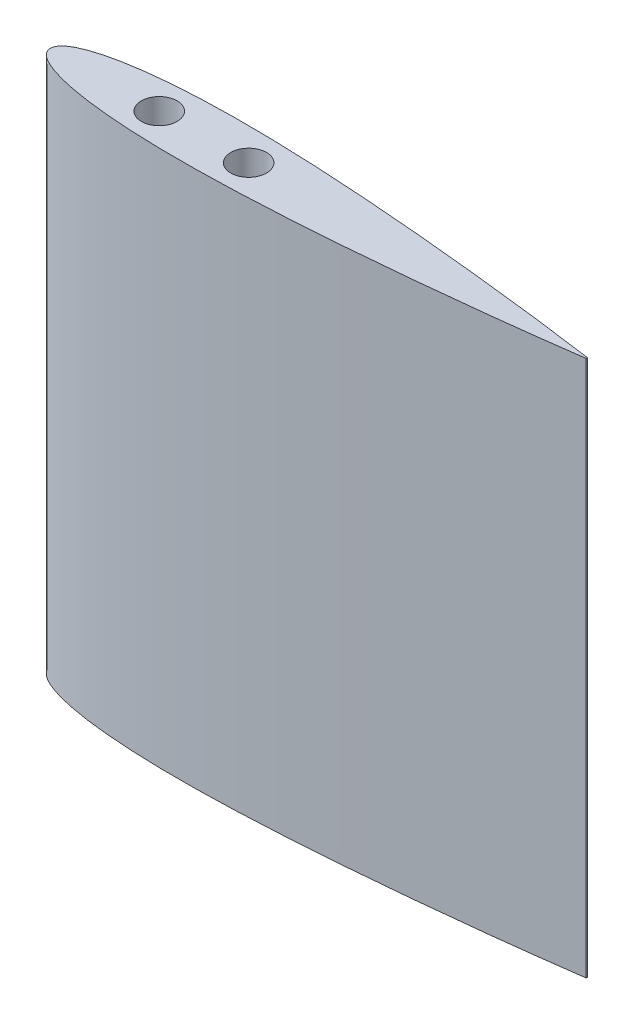
ISO-10303-21;
HEADER;
FILE_DESCRIPTION(('STEP AP214'),'2;1');
FILE_NAME('part.step','',(''),(''),'','','');
FILE_SCHEMA(('AUTOMOTIVE_DESIGN { 1 0 10303 214 1 1 1 1 }'));
ENDSEC;
DATA;
#1=APPLICATION_CONTEXT('core data for automotive mechanical design processes');
#2=APPLICATION_PROTOCOL_DEFINITION('international standard','automotive_design',2000,#1);
#3=PRODUCT_CONTEXT('',#1,'mechanical');
#4=PRODUCT('Part','Part','',(#3));
#5=PRODUCT_RELATED_PRODUCT_CATEGORY('part','',(#4));
#6=PRODUCT_DEFINITION_FORMATION('','',#4);
#7=PRODUCT_DEFINITION_CONTEXT('part definition',#1,'design');
#8=PRODUCT_DEFINITION('design','',#6,#7);
#9=PRODUCT_DEFINITION_SHAPE('','',#8);
#10=(LENGTH_UNIT() NAMED_UNIT(*) SI_UNIT(.MILLI.,.METRE.));
#11=(NAMED_UNIT(*) PLANE_ANGLE_UNIT() SI_UNIT($,.RADIAN.));
#12=(NAMED_UNIT(*) SI_UNIT($,.STERADIAN.) SOLID_ANGLE_UNIT());
#13=UNCERTAINTY_MEASURE_WITH_UNIT(LENGTH_MEASURE(1.E-05),#10,'distance_accuracy_value','');
#14=(GEOMETRIC_REPRESENTATION_CONTEXT(3) GLOBAL_UNCERTAINTY_ASSIGNED_CONTEXT((#13)) GLOBAL_UNIT_ASSIGNED_CONTEXT((#10,
#11,#12)) REPRESENTATION_CONTEXT('',''));
#15=CARTESIAN_POINT('',(0.,0.,0.));
#16=DIRECTION('',(0.,0.,1.));
#17=DIRECTION('',(1.,0.,0.));
#18=AXIS2_PLACEMENT_3D('',#15,#16,#17);
#19=CARTESIAN_POINT('',(76.1989566502506,38.1,-0.0480060000004375));
#20=CARTESIAN_POINT('',(76.1915399014401,38.1,-0.0490477650060024));
#21=CARTESIAN_POINT('',(76.1618995618662,38.1,-0.0532110809426779));
#22=CARTESIAN_POINT('',(76.0436039036933,38.1,-0.0697558566797521));
#23=CARTESIAN_POINT('',(75.8665187753457,38.1,-0.0944867430918495));
#24=CARTESIAN_POINT('',(75.6310091709669,38.1,-0.126965391859817));
#25=CARTESIAN_POINT('',(75.3893532075569,38.1,-0.160190200640066));
#26=CARTESIAN_POINT('',(75.1050837660693,38.1,-0.198904989147177));
#27=CARTESIAN_POINT('',(74.7788745873881,38.1,-0.242859005883783));
#28=CARTESIAN_POINT('',(74.4114981954842,38.1,-0.29186429375764));
#29=CARTESIAN_POINT('',(74.0038084664137,38.1,-0.345569022589199));
#30=CARTESIAN_POINT('',(73.5567553297739,38.1,-0.403720925510189));
#31=CARTESIAN_POINT('',(73.0713736341047,38.1,-0.465853222349795));
#32=CARTESIAN_POINT('',(72.3510167519771,38.1,-0.556772440334828));
#33=CARTESIAN_POINT('',(71.583498245841,38.1,-0.651127112361768));
#34=CARTESIAN_POINT('',(70.770593968194,38.1,-0.748448048269034));
#35=CARTESIAN_POINT('',(70.1123104223475,38.1,-0.825737809246248));
#36=CARTESIAN_POINT('',(69.423727943532,38.1,-0.904853152717327));
#37=CARTESIAN_POINT('',(68.7064939321736,38.1,-0.985592030764006));
#38=CARTESIAN_POINT('',(67.9622610026192,38.1,-1.06737526082977));
#39=CARTESIAN_POINT('',(67.192790938636,38.1,-1.14998319028369));
#40=CARTESIAN_POINT('',(66.3998507297358,38.1,-1.23282548784193));
#41=CARTESIAN_POINT('',(65.5853094971878,38.1,-1.31574863637624));
#42=CARTESIAN_POINT('',(64.7510596252633,38.1,-1.39811320683203));
#43=CARTESIAN_POINT('',(63.8990626700967,38.1,-1.47966051292517));
#44=CARTESIAN_POINT('',(63.0312971234962,38.1,-1.55982417312114));
#45=CARTESIAN_POINT('',(62.1497872694255,38.1,-1.63834210110599));
#46=CARTESIAN_POINT('',(61.2565973065241,38.1,-1.71456520147231));
#47=CARTESIAN_POINT('',(60.3538087224743,38.1,-1.78815253623483));
#48=CARTESIAN_POINT('',(59.4435414358386,38.1,-1.8586341649136));
#49=CARTESIAN_POINT('',(58.5279098013775,38.1,-1.92544429568854));
#50=CARTESIAN_POINT('',(57.6090655922432,38.1,-1.98816390230962));
#51=CARTESIAN_POINT('',(56.6891537188279,38.1,-2.04629199099476));
#52=CARTESIAN_POINT('',(55.7703034883076,38.1,-2.09926717966157));
#53=CARTESIAN_POINT('',(54.5536892335224,38.1,-2.16225319255793));
#54=CARTESIAN_POINT('',(53.0515324187531,38.1,-2.22569702265728));
#55=CARTESIAN_POINT('',(51.5649281979661,38.1,-2.26664545387194));
#56=CARTESIAN_POINT('',(50.3990477819981,38.1,-2.28358455102085));
#57=CARTESIAN_POINT('',(49.5469916789001,38.1,-2.28804827308297));
#58=CARTESIAN_POINT('',(48.7126833054312,38.1,-2.28410223520037));
#59=CARTESIAN_POINT('',(47.8980752567122,38.1,-2.27156902201942));
#60=CARTESIAN_POINT('',(47.1050764204523,38.1,-2.25006986753491));
#61=CARTESIAN_POINT('',(46.3355212029017,38.1,-2.21969990978299));
#62=CARTESIAN_POINT('',(45.5912052603655,38.1,-2.18024093358921));
#63=CARTESIAN_POINT('',(44.873861454892,38.1,-2.13180353660569));
#64=CARTESIAN_POINT('',(44.1851789691338,38.1,-2.07439781875675));
#65=CARTESIAN_POINT('',(43.5267589482719,38.1,-2.00812811550931));
#66=CARTESIAN_POINT('',(42.9001312529817,38.1,-1.93324581886238));
#67=CARTESIAN_POINT('',(42.3067405051686,38.1,-1.85005530448893));
#68=CARTESIAN_POINT('',(41.7479845921671,38.1,-1.75871164667076));
#69=CARTESIAN_POINT('',(41.2251440770093,38.1,-1.65967136646697));
#70=CARTESIAN_POINT('',(40.7394222685257,38.1,-1.55330686977673));
#71=CARTESIAN_POINT('',(40.2919543382146,38.1,-1.43997872175097));
#72=CARTESIAN_POINT('',(39.8837290506632,38.1,-1.32019461373093));
#73=CARTESIAN_POINT('',(39.5156465419665,38.1,-1.19435234825147));
#74=CARTESIAN_POINT('',(39.1884917681487,38.1,-1.06288655664475));
#75=CARTESIAN_POINT('',(38.9029123471029,38.1,-0.926176493001515));
#76=CARTESIAN_POINT('',(38.6594523447893,38.1,-0.784506781043503));
#77=CARTESIAN_POINT('',(38.4583952602907,38.1,-0.638117578672521));
#78=CARTESIAN_POINT('',(38.3001295903998,38.1,-0.486768083972407));
#79=CARTESIAN_POINT('',(38.1850369971821,38.1,-0.330029548931137));
#80=CARTESIAN_POINT('',(38.1146692041191,38.1,-0.167135854074388));
#81=CARTESIAN_POINT('',(38.0912976935738,38.1,0.));
#82=CARTESIAN_POINT('',(38.1146692041191,38.1,0.167135854074272));
#83=CARTESIAN_POINT('',(38.1850369971821,38.1,0.330029548931012));
#84=CARTESIAN_POINT('',(38.3001295903998,38.1,0.486768083972286));
#85=CARTESIAN_POINT('',(38.4583952602907,38.1,0.638117578672393));
#86=CARTESIAN_POINT('',(38.6594523447893,38.1,0.784506781043372));
#87=CARTESIAN_POINT('',(38.9029123471029,38.1,0.926176493001381));
#88=CARTESIAN_POINT('',(39.1884917681487,38.1,1.06288655664461));
#89=CARTESIAN_POINT('',(39.5156465419666,38.1,1.19435234825133));
#90=CARTESIAN_POINT('',(39.8837290506632,38.1,1.32019461373078));
#91=CARTESIAN_POINT('',(40.2919543382146,38.1,1.4399787217508));
#92=CARTESIAN_POINT('',(40.7394222685258,38.1,1.55330686977656));
#93=CARTESIAN_POINT('',(41.2251440770094,38.1,1.65967136646679));
#94=CARTESIAN_POINT('',(41.7479845921671,38.1,1.75871164667057));
#95=CARTESIAN_POINT('',(42.3067405051687,38.1,1.85005530448873));
#96=CARTESIAN_POINT('',(42.9001312529818,38.1,1.93324581886216));
#97=CARTESIAN_POINT('',(43.526758948272,38.1,2.00812811550908));
#98=CARTESIAN_POINT('',(44.1851789691338,38.1,2.07439781875651));
#99=CARTESIAN_POINT('',(44.873861454892,38.1,2.13180353660544));
#100=CARTESIAN_POINT('',(45.5912052603655,38.1,2.18024093358894));
#101=CARTESIAN_POINT('',(46.3355212029018,38.1,2.2196999097827));
#102=CARTESIAN_POINT('',(47.1050764204523,38.1,2.25006986753461));
#103=CARTESIAN_POINT('',(47.8980752567123,38.1,2.27156902201911));
#104=CARTESIAN_POINT('',(48.7126833054313,38.1,2.28410223520004));
#105=CARTESIAN_POINT('',(49.5469916789001,38.1,2.28804827308262));
#106=CARTESIAN_POINT('',(50.3990477819981,38.1,2.28358455102048));
#107=CARTESIAN_POINT('',(51.5649281979662,38.1,2.26664545387155));
#108=CARTESIAN_POINT('',(52.7476688064124,38.1,2.23406692908831));
#109=CARTESIAN_POINT('',(54.2500260840639,38.1,2.1762155967344));
#110=CARTESIAN_POINT('',(55.4668374509797,38.1,2.11676314369032));
#111=CARTESIAN_POINT('',(56.6891537188279,38.1,2.04629199099427));
#112=CARTESIAN_POINT('',(57.6090655922433,38.1,1.98816390230912));
#113=CARTESIAN_POINT('',(58.5279098013776,38.1,1.92544429568802));
#114=CARTESIAN_POINT('',(59.4435414358386,38.1,1.85863416491306));
#115=CARTESIAN_POINT('',(60.3538087224743,38.1,1.78815253623426));
#116=CARTESIAN_POINT('',(61.2565973065241,38.1,1.71456520147173));
#117=CARTESIAN_POINT('',(62.1497872694255,38.1,1.63834210110539));
#118=CARTESIAN_POINT('',(63.0312971234962,38.1,1.55982417312052));
#119=CARTESIAN_POINT('',(63.8990626700967,38.1,1.47966051292454));
#120=CARTESIAN_POINT('',(64.7510596252633,38.1,1.39811320683138));
#121=CARTESIAN_POINT('',(65.5853094971878,38.1,1.31574863637558));
#122=CARTESIAN_POINT('',(66.3998507297358,38.1,1.23282548784125));
#123=CARTESIAN_POINT('',(67.1927909386361,38.1,1.14998319028299));
#124=CARTESIAN_POINT('',(67.9622610026192,38.1,1.06737526082906));
#125=CARTESIAN_POINT('',(68.7064939321736,38.1,0.985592030763277));
#126=CARTESIAN_POINT('',(69.423727943532,38.1,0.904853152716587));
#127=CARTESIAN_POINT('',(70.1123104223476,38.1,0.825737809245494));
#128=CARTESIAN_POINT('',(70.770593968194,38.1,0.748448048268266));
#129=CARTESIAN_POINT('',(71.583498245841,38.1,0.651127112360985));
#130=CARTESIAN_POINT('',(72.3510167519771,38.1,0.55677244033403));
#131=CARTESIAN_POINT('',(73.0713736341047,38.1,0.465853222348983));
#132=CARTESIAN_POINT('',(73.5567553297739,38.1,0.403720925509366));
#133=CARTESIAN_POINT('',(74.0038084664137,38.1,0.345569022588368));
#134=CARTESIAN_POINT('',(74.4114981954842,38.1,0.2918642937568));
#135=CARTESIAN_POINT('',(74.7788745873881,38.1,0.242859005882935));
#136=CARTESIAN_POINT('',(75.1050837660693,38.1,0.198904989146324));
#137=CARTESIAN_POINT('',(75.389353207557,38.1,0.160190200639207));
#138=CARTESIAN_POINT('',(75.6310091709668,38.1,0.126965391858953));
#139=CARTESIAN_POINT('',(75.8665187753457,38.1,0.0944867430909816));
#140=CARTESIAN_POINT('',(76.0436039036934,38.1,0.0697558566788804));
#141=CARTESIAN_POINT('',(76.1618995618662,38.1,0.053211080941803));
#142=CARTESIAN_POINT('',(76.1915399014401,38.1,0.0490477650051275));
#143=CARTESIAN_POINT('',(76.1989566502506,38.1,0.0480059999995625));
#144=B_SPLINE_CURVE_WITH_KNOTS('',3,(#19,#20,#21,#22,#23,#24,#25,#26,#27,#28,#29,#30,#31,#32,
#33,#34,#35,#36,#37,#38,#39,#40,#41,#42,#43,#44,#45,#46,#47,#48,#49,#50,#51,#52,#53,#54,#55,#56,
#57,#58,#59,#60,#61,#62,#63,#64,#65,#66,#67,#68,#69,#70,#71,#72,#73,#74,#75,#76,#77,#78,#79,#80,
#81,#82,#83,#84,#85,#86,#87,#88,#89,#90,#91,#92,#93,#94,#95,#96,#97,#98,#99,#100,#101,#102,#103,
#104,#105,#106,#107,#108,#109,#110,#111,#112,#113,#114,#115,#116,#117,#118,#119,#120,#121,#122,
#123,#124,#125,#126,#127,#128,#129,#130,#131,#132,#133,#134,#135,#136,#137,#138,#139,#140,#141,
#142,#143),.UNSPECIFIED.,.F.,.F.,(4,1,1,1,1,1,1,1,1,1,1,1,1,1,1,1,1,1,1,1,1,1,1,1,1,1,1,1,1,1,1,
1,1,1,1,1,1,1,1,1,1,1,1,1,1,1,1,1,1,1,1,1,1,1,1,1,1,1,1,1,1,1,1,1,1,1,1,1,1,1,1,1,1,1,1,1,1,1,1,
1,1,1,1,1,1,1,1,1,1,1,1,1,1,1,1,1,1,1,1,1,1,1,1,1,1,1,1,1,1,1,1,1,1,1,1,1,1,1,1,1,1,1,4),(0.,
0.000289201378228521,0.00115576612811497,0.00461232240327458,0.00719351750498132,
0.0103357928948399,0.0140313969623455,0.018271612085312,0.0230458473649678,0.028342900869087,
0.0341501195438392,0.0404537601194176,0.0472383298988337,0.0621866127014249,0.0703137241968128,
0.0788519079930909,0.0877801263970521,0.0970775209084767,0.106722048517726,0.116690867689892,
0.126960504753417,0.137507218023907,0.148306054540842,0.159330764906486,0.170556489755232,
0.181956531155254,0.193504043461122,0.205171366742428,0.216932300344852,0.228758168756787,
0.24062140048393,0.252494935762872,0.264350287074715,0.276160573352716,0.299535853600575,
0.322404758964057,0.333584031906799,0.344559265520828,0.35530595971865,0.365799778375851,
0.376017570419826,0.385937299648592,0.395537658905913,0.404797976198219,0.413698812078543,
0.422221441287427,0.430349273099822,0.438066019294824,0.445356904422305,0.452209372098903,
0.458611567079498,0.46455404405062,0.470029850192536,0.475034902370301,0.479569141493346,
0.483636857140142,0.487250262770082,0.490431337960153,0.493218828079602,0.495674085869199,
0.497891368316545,0.5,0.502108631683455,0.504325914130801,0.506781171920398,0.509568662039847,
0.512749737229917,0.516363142859858,0.520430858506653,0.524965097629699,0.529970149807463,
0.535445955949379,0.541388432920502,0.547790627901097,0.554643095577695,0.561933980705176,
0.569650726900177,0.577778558712573,0.586301187921457,0.595202023801781,0.604462341094087,
0.614062700351407,0.623982429580174,0.634200221624149,0.64469404028135,0.655440734479172,
0.666415968093201,0.677595241035942,0.700464146399425,0.712102005681195,0.735649712925285,
0.747505064237128,0.759378599516069,0.771241831243212,0.783067699655148,0.794828633257571,
0.806495956538878,0.818043468844746,0.829443510244767,0.840669235093514,0.851693945459158,
0.862492781976093,0.873039495246583,0.883309132310108,0.893277951482274,0.902922479091523,
0.912219873602948,0.921148092006909,0.929686275803187,0.937813387298575,0.952761670101166,
0.959546239880582,0.965849880456161,0.971657099130913,0.976954152635032,0.981728387914688,
0.985968603037654,0.98966420710516,0.992806482495019,0.995387677596725,0.998844233871885,
0.999710798621771,1.),.UNSPECIFIED.);
#145=DIRECTION('',(0.,-1.,0.));
#146=VECTOR('',#145,1.);
#147=SURFACE_OF_LINEAR_EXTRUSION('',#144,#146);
#148=CARTESIAN_POINT('',(76.1989566502506,0.,-0.0480060000004375));
#149=CARTESIAN_POINT('',(76.1915399014401,0.,-0.0490477650060024));
#150=CARTESIAN_POINT('',(76.1618995618662,0.,-0.0532110809426779));
#151=CARTESIAN_POINT('',(76.0436039036933,0.,-0.0697558566797521));
#152=CARTESIAN_POINT('',(75.8665187753457,0.,-0.0944867430918495));
#153=CARTESIAN_POINT('',(75.6310091709669,0.,-0.126965391859817));
#154=CARTESIAN_POINT('',(75.3893532075569,0.,-0.160190200640066));
#155=CARTESIAN_POINT('',(75.1050837660693,0.,-0.198904989147177));
#156=CARTESIAN_POINT('',(74.7788745873881,0.,-0.242859005883783));
#157=CARTESIAN_POINT('',(74.4114981954842,0.,-0.29186429375764));
#158=CARTESIAN_POINT('',(74.0038084664137,0.,-0.345569022589199));
#159=CARTESIAN_POINT('',(73.5567553297739,0.,-0.403720925510189));
#160=CARTESIAN_POINT('',(73.0713736341047,0.,-0.465853222349795));
#161=CARTESIAN_POINT('',(72.3510167519771,0.,-0.556772440334828));
#162=CARTESIAN_POINT('',(71.583498245841,0.,-0.651127112361768));
#163=CARTESIAN_POINT('',(70.770593968194,0.,-0.748448048269034));
#164=CARTESIAN_POINT('',(70.1123104223475,0.,-0.825737809246248));
#165=CARTESIAN_POINT('',(69.423727943532,0.,-0.904853152717327));
#166=CARTESIAN_POINT('',(68.7064939321736,0.,-0.985592030764006));
#167=CARTESIAN_POINT('',(67.9622610026192,0.,-1.06737526082977));
#168=CARTESIAN_POINT('',(67.192790938636,0.,-1.14998319028369));
#169=CARTESIAN_POINT('',(66.3998507297358,0.,-1.23282548784193));
#170=CARTESIAN_POINT('',(65.5853094971878,0.,-1.31574863637624));
#171=CARTESIAN_POINT('',(64.7510596252633,0.,-1.39811320683203));
#172=CARTESIAN_POINT('',(63.8990626700967,0.,-1.47966051292517));
#173=CARTESIAN_POINT('',(63.0312971234962,0.,-1.55982417312114));
#174=CARTESIAN_POINT('',(62.1497872694255,0.,-1.63834210110599));
#175=CARTESIAN_POINT('',(61.2565973065241,0.,-1.71456520147231));
#176=CARTESIAN_POINT('',(60.3538087224743,0.,-1.78815253623483));
#177=CARTESIAN_POINT('',(59.4435414358386,0.,-1.8586341649136));
#178=CARTESIAN_POINT('',(58.5279098013775,0.,-1.92544429568854));
#179=CARTESIAN_POINT('',(57.6090655922432,0.,-1.98816390230962));
#180=CARTESIAN_POINT('',(56.6891537188279,0.,-2.04629199099476));
#181=CARTESIAN_POINT('',(55.7703034883076,0.,-2.09926717966157));
#182=CARTESIAN_POINT('',(54.5536892335224,0.,-2.16225319255793));
#183=CARTESIAN_POINT('',(53.0515324187531,0.,-2.22569702265728));
#184=CARTESIAN_POINT('',(51.5649281979661,0.,-2.26664545387194));
#185=CARTESIAN_POINT('',(50.3990477819981,0.,-2.28358455102085));
#186=CARTESIAN_POINT('',(49.5469916789001,0.,-2.28804827308297));
#187=CARTESIAN_POINT('',(48.7126833054312,0.,-2.28410223520037));
#188=CARTESIAN_POINT('',(47.8980752567122,0.,-2.27156902201942));
#189=CARTESIAN_POINT('',(47.1050764204523,0.,-2.25006986753491));
#190=CARTESIAN_POINT('',(46.3355212029017,0.,-2.21969990978299));
#191=CARTESIAN_POINT('',(45.5912052603655,0.,-2.18024093358921));
#192=CARTESIAN_POINT('',(44.873861454892,0.,-2.13180353660569));
#193=CARTESIAN_POINT('',(44.1851789691338,0.,-2.07439781875675));
#194=CARTESIAN_POINT('',(43.5267589482719,0.,-2.00812811550931));
#195=CARTESIAN_POINT('',(42.9001312529817,0.,-1.93324581886238));
#196=CARTESIAN_POINT('',(42.3067405051686,0.,-1.85005530448893));
#197=CARTESIAN_POINT('',(41.7479845921671,0.,-1.75871164667076));
#198=CARTESIAN_POINT('',(41.2251440770093,0.,-1.65967136646697));
#199=CARTESIAN_POINT('',(40.7394222685257,0.,-1.55330686977673));
#200=CARTESIAN_POINT('',(40.2919543382146,0.,-1.43997872175097));
#201=CARTESIAN_POINT('',(39.8837290506632,0.,-1.32019461373093));
#202=CARTESIAN_POINT('',(39.5156465419665,0.,-1.19435234825147));
#203=CARTESIAN_POINT('',(39.1884917681487,0.,-1.06288655664475));
#204=CARTESIAN_POINT('',(38.9029123471029,0.,-0.926176493001515));
#205=CARTESIAN_POINT('',(38.6594523447893,0.,-0.784506781043503));
#206=CARTESIAN_POINT('',(38.4583952602907,0.,-0.638117578672521));
#207=CARTESIAN_POINT('',(38.3001295903998,0.,-0.486768083972407));
#208=CARTESIAN_POINT('',(38.1850369971821,0.,-0.330029548931137));
#209=CARTESIAN_POINT('',(38.1146692041191,0.,-0.167135854074388));
#210=CARTESIAN_POINT('',(38.0912976935738,0.,0.));
#211=CARTESIAN_POINT('',(38.1146692041191,0.,0.167135854074272));
#212=CARTESIAN_POINT('',(38.1850369971821,0.,0.330029548931012));
#213=CARTESIAN_POINT('',(38.3001295903998,0.,0.486768083972286));
#214=CARTESIAN_POINT('',(38.4583952602907,0.,0.638117578672393));
#215=CARTESIAN_POINT('',(38.6594523447893,0.,0.784506781043372));
#216=CARTESIAN_POINT('',(38.9029123471029,0.,0.926176493001381));
#217=CARTESIAN_POINT('',(39.1884917681487,0.,1.06288655664461));
#218=CARTESIAN_POINT('',(39.5156465419666,0.,1.19435234825133));
#219=CARTESIAN_POINT('',(39.8837290506632,0.,1.32019461373078));
#220=CARTESIAN_POINT('',(40.2919543382146,0.,1.4399787217508));
#221=CARTESIAN_POINT('',(40.7394222685258,0.,1.55330686977656));
#222=CARTESIAN_POINT('',(41.2251440770094,0.,1.65967136646679));
#223=CARTESIAN_POINT('',(41.7479845921671,0.,1.75871164667057));
#224=CARTESIAN_POINT('',(42.3067405051687,0.,1.85005530448873));
#225=CARTESIAN_POINT('',(42.9001312529818,0.,1.93324581886216));
#226=CARTESIAN_POINT('',(43.526758948272,0.,2.00812811550908));
#227=CARTESIAN_POINT('',(44.1851789691338,0.,2.07439781875651));
#228=CARTESIAN_POINT('',(44.873861454892,0.,2.13180353660544));
#229=CARTESIAN_POINT('',(45.5912052603655,0.,2.18024093358894));
#230=CARTESIAN_POINT('',(46.3355212029018,0.,2.2196999097827));
#231=CARTESIAN_POINT('',(47.1050764204523,0.,2.25006986753461));
#232=CARTESIAN_POINT('',(47.8980752567123,0.,2.27156902201911));
#233=CARTESIAN_POINT('',(48.7126833054313,0.,2.28410223520004));
#234=CARTESIAN_POINT('',(49.5469916789001,0.,2.28804827308262));
#235=CARTESIAN_POINT('',(50.3990477819981,0.,2.28358455102048));
#236=CARTESIAN_POINT('',(51.5649281979662,0.,2.26664545387155));
#237=CARTESIAN_POINT('',(52.7476688064124,0.,2.23406692908831));
#238=CARTESIAN_POINT('',(54.2500260840639,0.,2.1762155967344));
#239=CARTESIAN_POINT('',(55.4668374509797,0.,2.11676314369032));
#240=CARTESIAN_POINT('',(56.6891537188279,0.,2.04629199099427));
#241=CARTESIAN_POINT('',(57.6090655922433,0.,1.98816390230912));
#242=CARTESIAN_POINT('',(58.5279098013776,0.,1.92544429568802));
#243=CARTESIAN_POINT('',(59.4435414358386,0.,1.85863416491306));
#244=CARTESIAN_POINT('',(60.3538087224743,0.,1.78815253623426));
#245=CARTESIAN_POINT('',(61.2565973065241,0.,1.71456520147173));
#246=CARTESIAN_POINT('',(62.1497872694255,0.,1.63834210110539));
#247=CARTESIAN_POINT('',(63.0312971234962,0.,1.55982417312052));
#248=CARTESIAN_POINT('',(63.8990626700967,0.,1.47966051292454));
#249=CARTESIAN_POINT('',(64.7510596252633,0.,1.39811320683138));
#250=CARTESIAN_POINT('',(65.5853094971878,0.,1.31574863637558));
#251=CARTESIAN_POINT('',(66.3998507297358,0.,1.23282548784125));
#252=CARTESIAN_POINT('',(67.1927909386361,0.,1.14998319028299));
#253=CARTESIAN_POINT('',(67.9622610026192,0.,1.06737526082906));
#254=CARTESIAN_POINT('',(68.7064939321736,0.,0.985592030763277));
#255=CARTESIAN_POINT('',(69.423727943532,0.,0.904853152716587));
#256=CARTESIAN_POINT('',(70.1123104223476,0.,0.825737809245494));
#257=CARTESIAN_POINT('',(70.770593968194,0.,0.748448048268266));
#258=CARTESIAN_POINT('',(71.583498245841,0.,0.651127112360985));
#259=CARTESIAN_POINT('',(72.3510167519771,0.,0.55677244033403));
#260=CARTESIAN_POINT('',(73.0713736341047,0.,0.465853222348983));
#261=CARTESIAN_POINT('',(73.5567553297739,0.,0.403720925509366));
#262=CARTESIAN_POINT('',(74.0038084664137,0.,0.345569022588368));
#263=CARTESIAN_POINT('',(74.4114981954842,0.,0.2918642937568));
#264=CARTESIAN_POINT('',(74.7788745873881,0.,0.242859005882935));
#265=CARTESIAN_POINT('',(75.1050837660693,0.,0.198904989146324));
#266=CARTESIAN_POINT('',(75.389353207557,0.,0.160190200639207));
#267=CARTESIAN_POINT('',(75.6310091709668,0.,0.126965391858953));
#268=CARTESIAN_POINT('',(75.8665187753457,0.,0.0944867430909816));
#269=CARTESIAN_POINT('',(76.0436039036934,0.,0.0697558566788804));
#270=CARTESIAN_POINT('',(76.1618995618662,0.,0.053211080941803));
#271=CARTESIAN_POINT('',(76.1915399014401,0.,0.0490477650051275));
#272=CARTESIAN_POINT('',(76.1989566502506,0.,0.0480059999995625));
#273=B_SPLINE_CURVE_WITH_KNOTS('',3,(#148,#149,#150,#151,#152,#153,#154,#155,#156,#157,#158,
#159,#160,#161,#162,#163,#164,#165,#166,#167,#168,#169,#170,#171,#172,#173,#174,#175,#176,#177,
#178,#179,#180,#181,#182,#183,#184,#185,#186,#187,#188,#189,#190,#191,#192,#193,#194,#195,#196,
#197,#198,#199,#200,#201,#202,#203,#204,#205,#206,#207,#208,#209,#210,#211,#212,#213,#214,#215,
#216,#217,#218,#219,#220,#221,#222,#223,#224,#225,#226,#227,#228,#229,#230,#231,#232,#233,#234,
#235,#236,#237,#238,#239,#240,#241,#242,#243,#244,#245,#246,#247,#248,#249,#250,#251,#252,#253,
#254,#255,#256,#257,#258,#259,#260,#261,#262,#263,#264,#265,#266,#267,#268,#269,#270,#271,#272),
.UNSPECIFIED.,.F.,.F.,(4,1,1,1,1,1,1,1,1,1,1,1,1,1,1,1,1,1,1,1,1,1,1,1,1,1,1,1,1,1,1,1,1,1,1,1,
1,1,1,1,1,1,1,1,1,1,1,1,1,1,1,1,1,1,1,1,1,1,1,1,1,1,1,1,1,1,1,1,1,1,1,1,1,1,1,1,1,1,1,1,1,1,1,1,
1,1,1,1,1,1,1,1,1,1,1,1,1,1,1,1,1,1,1,1,1,1,1,1,1,1,1,1,1,1,1,1,1,1,1,1,1,1,4),(0.,
0.000289201378228521,0.00115576612811497,0.00461232240327458,0.00719351750498132,
0.0103357928948399,0.0140313969623455,0.018271612085312,0.0230458473649678,0.028342900869087,
0.0341501195438392,0.0404537601194176,0.0472383298988337,0.0621866127014249,0.0703137241968128,
0.0788519079930909,0.0877801263970521,0.0970775209084767,0.106722048517726,0.116690867689892,
0.126960504753417,0.137507218023907,0.148306054540842,0.159330764906486,0.170556489755232,
0.181956531155254,0.193504043461122,0.205171366742428,0.216932300344852,0.228758168756787,
0.24062140048393,0.252494935762872,0.264350287074715,0.276160573352716,0.299535853600575,
0.322404758964057,0.333584031906799,0.344559265520828,0.35530595971865,0.365799778375851,
0.376017570419826,0.385937299648592,0.395537658905913,0.404797976198219,0.413698812078543,
0.422221441287427,0.430349273099822,0.438066019294824,0.445356904422305,0.452209372098903,
0.458611567079498,0.46455404405062,0.470029850192536,0.475034902370301,0.479569141493346,
0.483636857140142,0.487250262770082,0.490431337960153,0.493218828079602,0.495674085869199,
0.497891368316545,0.5,0.502108631683455,0.504325914130801,0.506781171920398,0.509568662039847,
0.512749737229917,0.516363142859858,0.520430858506653,0.524965097629699,0.529970149807463,
0.535445955949379,0.541388432920502,0.547790627901097,0.554643095577695,0.561933980705176,
0.569650726900177,0.577778558712573,0.586301187921457,0.595202023801781,0.604462341094087,
0.614062700351407,0.623982429580174,0.634200221624149,0.64469404028135,0.655440734479172,
0.666415968093201,0.677595241035942,0.700464146399425,0.712102005681195,0.735649712925285,
0.747505064237128,0.759378599516069,0.771241831243212,0.783067699655148,0.794828633257571,
0.806495956538878,0.818043468844746,0.829443510244767,0.840669235093514,0.851693945459158,
0.862492781976093,0.873039495246583,0.883309132310108,0.893277951482274,0.902922479091523,
0.912219873602948,0.921148092006909,0.929686275803187,0.937813387298575,0.952761670101166,
0.959546239880582,0.965849880456161,0.971657099130913,0.976954152635032,0.981728387914688,
0.985968603037654,0.98966420710516,0.992806482495019,0.995387677596725,0.998844233871885,
0.999710798621771,1.),.UNSPECIFIED.);
#274=CARTESIAN_POINT('',(76.1989566502506,0.,-0.0480060000004375));
#275=VERTEX_POINT('',#274);
#276=CARTESIAN_POINT('',(76.1989566502506,0.,0.0480059999995625));
#277=VERTEX_POINT('',#276);
#278=EDGE_CURVE('E72',#275,#277,#273,.T.);
#279=ORIENTED_EDGE('',*,*,#278,.T.);
#280=DIRECTION('',(0.,-1.,0.));
#281=VECTOR('',#280,1.);
#282=CARTESIAN_POINT('',(76.1989566502506,38.1,0.0480059999995625));
#283=LINE('',#282,#281);
#284=CARTESIAN_POINT('',(76.1989566502506,38.1,0.0480059999995625));
#285=VERTEX_POINT('',#284);
#286=EDGE_CURVE('E11',#285,#277,#283,.T.);
#287=ORIENTED_EDGE('',*,*,#286,.F.);
#288=CARTESIAN_POINT('',(76.1989566502506,38.1,-0.0480060000004375));
#289=VERTEX_POINT('',#288);
#290=EDGE_CURVE('E71',#289,#285,#144,.T.);
#291=ORIENTED_EDGE('',*,*,#290,.F.);
#292=DIRECTION('',(0.,-1.,0.));
#293=VECTOR('',#292,1.);
#294=CARTESIAN_POINT('',(76.1989566502506,38.1,-0.0480060000004375));
#295=LINE('',#294,#293);
#296=EDGE_CURVE('E49',#289,#275,#295,.T.);
#297=ORIENTED_EDGE('',*,*,#296,.T.);
#298=EDGE_LOOP('',(#279,#287,#291,#297));
#299=FACE_BOUND('',#298,.T.);
#300=ADVANCED_FACE('F40',(#299),#147,.F.);
#301=CARTESIAN_POINT('',(76.1989566502506,38.1,-0.0480060000004375));
#302=DIRECTION('',(-1.,0.,0.));
#303=DIRECTION('',(0.,0.,1.));
#304=AXIS2_PLACEMENT_3D('',#301,#302,#303);
#305=PLANE('',#304);
#306=DIRECTION('',(0.,0.,-1.));
#307=VECTOR('',#306,1.);
#308=CARTESIAN_POINT('',(76.1989566502506,0.,-0.0480060000004375));
#309=LINE('',#308,#307);
#310=EDGE_CURVE('E64',#277,#275,#309,.T.);
#311=ORIENTED_EDGE('',*,*,#310,.T.);
#312=ORIENTED_EDGE('',*,*,#296,.F.);
#313=DIRECTION('',(0.,0.,-1.));
#314=VECTOR('',#313,1.);
#315=CARTESIAN_POINT('',(76.1989566502506,38.1,-0.0480060000004375));
#316=LINE('',#315,#314);
#317=EDGE_CURVE('E56',#285,#289,#316,.T.);
#318=ORIENTED_EDGE('',*,*,#317,.F.);
#319=ORIENTED_EDGE('',*,*,#286,.T.);
#320=EDGE_LOOP('',(#311,#312,#318,#319));
#321=FACE_BOUND('',#320,.T.);
#322=ADVANCED_FACE('F67',(#321),#305,.F.);
#323=CARTESIAN_POINT('',(38.0989566502505,38.1,0.));
#324=DIRECTION('',(0.,1.,0.));
#325=DIRECTION('',(0.,0.,1.));
#326=AXIS2_PLACEMENT_3D('',#323,#324,#325);
#327=PLANE('',#326);
#328=CARTESIAN_POINT('',(45.8305073722229,38.1,0.));
#329=DIRECTION('',(0.,1.,0.));
#330=DIRECTION('',(0.,0.,1.));
#331=AXIS2_PLACEMENT_3D('',#328,#329,#330);
#332=CIRCLE('',#331,1.27);
#333=CARTESIAN_POINT('',(45.8305073722229,38.1,1.27));
#334=VERTEX_POINT('',#333);
#335=EDGE_CURVE('E79',#334,#334,#332,.T.);
#336=ORIENTED_EDGE('',*,*,#335,.F.);
#337=EDGE_LOOP('',(#336));
#338=FACE_BOUND('',#337,.T.);
#339=CARTESIAN_POINT('',(52.1805073722229,38.1,0.));
#340=DIRECTION('',(0.,1.,0.));
#341=DIRECTION('',(0.,0.,1.));
#342=AXIS2_PLACEMENT_3D('',#339,#340,#341);
#343=CIRCLE('',#342,1.27);
#344=CARTESIAN_POINT('',(52.1805073722229,38.1,1.27));
#345=VERTEX_POINT('',#344);
#346=EDGE_CURVE('E97',#345,#345,#343,.T.);
#347=ORIENTED_EDGE('',*,*,#346,.F.);
#348=EDGE_LOOP('',(#347));
#349=FACE_BOUND('',#348,.T.);
#350=ORIENTED_EDGE('',*,*,#290,.T.);
#351=ORIENTED_EDGE('',*,*,#317,.T.);
#352=EDGE_LOOP('',(#350,#351));
#353=FACE_BOUND('',#352,.T.);
#354=ADVANCED_FACE('F105',(#338,#349,#353),#327,.T.);
#355=CARTESIAN_POINT('',(38.0989566502505,0.,0.));
#356=DIRECTION('',(0.,1.,0.));
#357=DIRECTION('',(0.,0.,1.));
#358=AXIS2_PLACEMENT_3D('',#355,#356,#357);
#359=PLANE('',#358);
#360=ORIENTED_EDGE('',*,*,#278,.F.);
#361=ORIENTED_EDGE('',*,*,#310,.F.);
#362=EDGE_LOOP('',(#360,#361));
#363=FACE_BOUND('',#362,.T.);
#364=ADVANCED_FACE('F75',(#363),#359,.F.);
#365=CARTESIAN_POINT('',(52.1805073722229,25.4,0.));
#366=DIRECTION('',(0.,1.,0.));
#367=DIRECTION('',(0.,0.,1.));
#368=AXIS2_PLACEMENT_3D('',#365,#366,#367);
#369=CYLINDRICAL_SURFACE('',#368,1.27);
#370=CARTESIAN_POINT('',(52.1805073722229,25.4,0.));
#371=DIRECTION('',(0.,1.,0.));
#372=DIRECTION('',(0.,0.,1.));
#373=AXIS2_PLACEMENT_3D('',#370,#371,#372);
#374=CIRCLE('',#373,1.27);
#375=CARTESIAN_POINT('',(52.1805073722229,25.4,1.27));
#376=VERTEX_POINT('',#375);
#377=EDGE_CURVE('E91',#376,#376,#374,.T.);
#378=ORIENTED_EDGE('',*,*,#377,.F.);
#379=EDGE_LOOP('',(#378));
#380=FACE_BOUND('',#379,.T.);
#381=ORIENTED_EDGE('',*,*,#346,.T.);
#382=EDGE_LOOP('',(#381));
#383=FACE_BOUND('',#382,.T.);
#384=ADVANCED_FACE('F111',(#380,#383),#369,.F.);
#385=CARTESIAN_POINT('',(52.1805073722229,25.4,0.));
#386=DIRECTION('',(0.,1.,0.));
#387=DIRECTION('',(0.,0.,1.));
#388=AXIS2_PLACEMENT_3D('',#385,#386,#387);
#389=PLANE('',#388);
#390=ORIENTED_EDGE('',*,*,#377,.T.);
#391=EDGE_LOOP('',(#390));
#392=FACE_BOUND('',#391,.T.);
#393=ADVANCED_FACE('F113',(#392),#389,.T.);
#394=CARTESIAN_POINT('',(45.8305073722229,25.4,0.));
#395=DIRECTION('',(0.,1.,0.));
#396=DIRECTION('',(0.,0.,1.));
#397=AXIS2_PLACEMENT_3D('',#394,#395,#396);
#398=CYLINDRICAL_SURFACE('',#397,1.27);
#399=CARTESIAN_POINT('',(45.8305073722229,25.4,0.));
#400=DIRECTION('',(0.,1.,0.));
#401=DIRECTION('',(0.,0.,1.));
#402=AXIS2_PLACEMENT_3D('',#399,#400,#401);
#403=CIRCLE('',#402,1.27);
#404=CARTESIAN_POINT('',(45.8305073722229,25.4,1.27));
#405=VERTEX_POINT('',#404);
#406=EDGE_CURVE('E76',#405,#405,#403,.T.);
#407=ORIENTED_EDGE('',*,*,#406,.F.);
#408=EDGE_LOOP('',(#407));
#409=FACE_BOUND('',#408,.T.);
#410=ORIENTED_EDGE('',*,*,#335,.T.);
#411=EDGE_LOOP('',(#410));
#412=FACE_BOUND('',#411,.T.);
#413=ADVANCED_FACE('F103',(#409,#412),#398,.F.);
#414=CARTESIAN_POINT('',(45.8305073722229,25.4,0.));
#415=DIRECTION('',(0.,1.,0.));
#416=DIRECTION('',(0.,0.,1.));
#417=AXIS2_PLACEMENT_3D('',#414,#415,#416);
#418=PLANE('',#417);
#419=ORIENTED_EDGE('',*,*,#406,.T.);
#420=EDGE_LOOP('',(#419));
#421=FACE_BOUND('',#420,.T.);
#422=ADVANCED_FACE('F168',(#421),#418,.T.);
#423=CLOSED_SHELL('',(#300,#322,#354,#364,#384,#393,#413,#422));
#424=MANIFOLD_SOLID_BREP('B2',#423);
#425=ADVANCED_BREP_SHAPE_REPRESENTATION('',(#18,#424),#14);
#426=SHAPE_DEFINITION_REPRESENTATION(#9,#425);
ENDSEC;
END-ISO-10303-21;
